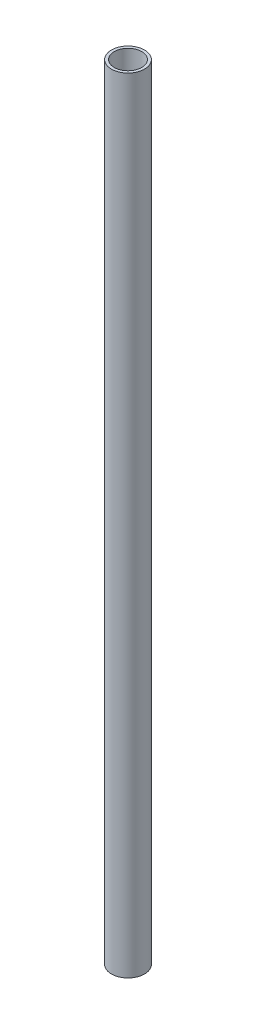
ISO-10303-21;
HEADER;
FILE_DESCRIPTION(('STEP AP214'),'2;1');
FILE_NAME('part.step','',(''),(''),'','','');
FILE_SCHEMA(('AUTOMOTIVE_DESIGN { 1 0 10303 214 1 1 1 1 }'));
ENDSEC;
DATA;
#1=APPLICATION_CONTEXT('core data for automotive mechanical design processes');
#2=APPLICATION_PROTOCOL_DEFINITION('international standard','automotive_design',2000,#1);
#3=PRODUCT_CONTEXT('',#1,'mechanical');
#4=PRODUCT('Part','Part','',(#3));
#5=PRODUCT_RELATED_PRODUCT_CATEGORY('part','',(#4));
#6=PRODUCT_DEFINITION_FORMATION('','',#4);
#7=PRODUCT_DEFINITION_CONTEXT('part definition',#1,'design');
#8=PRODUCT_DEFINITION('design','',#6,#7);
#9=PRODUCT_DEFINITION_SHAPE('','',#8);
#10=(LENGTH_UNIT() NAMED_UNIT(*) SI_UNIT(.MILLI.,.METRE.));
#11=(NAMED_UNIT(*) PLANE_ANGLE_UNIT() SI_UNIT($,.RADIAN.));
#12=(NAMED_UNIT(*) SI_UNIT($,.STERADIAN.) SOLID_ANGLE_UNIT());
#13=UNCERTAINTY_MEASURE_WITH_UNIT(LENGTH_MEASURE(1.E-05),#10,'distance_accuracy_value','');
#14=(GEOMETRIC_REPRESENTATION_CONTEXT(3) GLOBAL_UNCERTAINTY_ASSIGNED_CONTEXT((#13)) GLOBAL_UNIT_ASSIGNED_CONTEXT((#10,
#11,#12)) REPRESENTATION_CONTEXT('',''));
#15=CARTESIAN_POINT('',(0.,0.,0.));
#16=DIRECTION('',(0.,0.,1.));
#17=DIRECTION('',(1.,0.,0.));
#18=AXIS2_PLACEMENT_3D('',#15,#16,#17);
#19=CARTESIAN_POINT('',(0.,996.95,0.));
#20=DIRECTION('',(0.,1.,0.));
#21=DIRECTION('',(0.,0.,1.));
#22=AXIS2_PLACEMENT_3D('',#19,#20,#21);
#23=PLANE('',#22);
#24=CARTESIAN_POINT('',(0.,996.95,0.));
#25=DIRECTION('',(0.,1.,0.));
#26=DIRECTION('',(0.,0.,1.));
#27=AXIS2_PLACEMENT_3D('',#24,#25,#26);
#28=CIRCLE('',#27,21.082);
#29=CARTESIAN_POINT('',(0.,996.95,21.082));
#30=VERTEX_POINT('',#29);
#31=EDGE_CURVE('E12',#30,#30,#28,.T.);
#32=ORIENTED_EDGE('',*,*,#31,.T.);
#33=EDGE_LOOP('',(#32));
#34=FACE_BOUND('',#33,.T.);
#35=CARTESIAN_POINT('',(0.,996.95,0.));
#36=DIRECTION('',(0.,1.,0.));
#37=DIRECTION('',(0.,0.,1.));
#38=AXIS2_PLACEMENT_3D('',#35,#36,#37);
#39=CIRCLE('',#38,17.526);
#40=CARTESIAN_POINT('',(0.,996.95,17.526));
#41=VERTEX_POINT('',#40);
#42=EDGE_CURVE('E51',#41,#41,#39,.T.);
#43=ORIENTED_EDGE('',*,*,#42,.F.);
#44=EDGE_LOOP('',(#43));
#45=FACE_BOUND('',#44,.T.);
#46=ADVANCED_FACE('F40',(#34,#45),#23,.T.);
#47=CARTESIAN_POINT('',(0.,0.,0.));
#48=DIRECTION('',(0.,1.,0.));
#49=DIRECTION('',(0.,0.,1.));
#50=AXIS2_PLACEMENT_3D('',#47,#48,#49);
#51=PLANE('',#50);
#52=CARTESIAN_POINT('',(0.,0.,0.));
#53=DIRECTION('',(0.,1.,0.));
#54=DIRECTION('',(0.,0.,1.));
#55=AXIS2_PLACEMENT_3D('',#52,#53,#54);
#56=CIRCLE('',#55,21.082);
#57=CARTESIAN_POINT('',(0.,0.,21.082));
#58=VERTEX_POINT('',#57);
#59=EDGE_CURVE('E44',#58,#58,#56,.T.);
#60=ORIENTED_EDGE('',*,*,#59,.F.);
#61=EDGE_LOOP('',(#60));
#62=FACE_BOUND('',#61,.T.);
#63=CARTESIAN_POINT('',(0.,0.,0.));
#64=DIRECTION('',(0.,1.,0.));
#65=DIRECTION('',(0.,0.,1.));
#66=AXIS2_PLACEMENT_3D('',#63,#64,#65);
#67=CIRCLE('',#66,17.526);
#68=CARTESIAN_POINT('',(0.,0.,17.526));
#69=VERTEX_POINT('',#68);
#70=EDGE_CURVE('E53',#69,#69,#67,.T.);
#71=ORIENTED_EDGE('',*,*,#70,.T.);
#72=EDGE_LOOP('',(#71));
#73=FACE_BOUND('',#72,.T.);
#74=ADVANCED_FACE('F63',(#62,#73),#51,.F.);
#75=CARTESIAN_POINT('',(0.,996.95,0.));
#76=DIRECTION('',(0.,-1.,0.));
#77=DIRECTION('',(0.,0.,-1.));
#78=AXIS2_PLACEMENT_3D('',#75,#76,#77);
#79=CYLINDRICAL_SURFACE('',#78,21.082);
#80=ORIENTED_EDGE('',*,*,#31,.F.);
#81=EDGE_LOOP('',(#80));
#82=FACE_BOUND('',#81,.T.);
#83=ORIENTED_EDGE('',*,*,#59,.T.);
#84=EDGE_LOOP('',(#83));
#85=FACE_BOUND('',#84,.T.);
#86=ADVANCED_FACE('F42',(#82,#85),#79,.T.);
#87=CARTESIAN_POINT('',(0.,996.95,0.));
#88=DIRECTION('',(0.,-1.,0.));
#89=DIRECTION('',(0.,0.,-1.));
#90=AXIS2_PLACEMENT_3D('',#87,#88,#89);
#91=CYLINDRICAL_SURFACE('',#90,17.526);
#92=ORIENTED_EDGE('',*,*,#42,.T.);
#93=EDGE_LOOP('',(#92));
#94=FACE_BOUND('',#93,.T.);
#95=ORIENTED_EDGE('',*,*,#70,.F.);
#96=EDGE_LOOP('',(#95));
#97=FACE_BOUND('',#96,.T.);
#98=ADVANCED_FACE('F59',(#94,#97),#91,.F.);
#99=CLOSED_SHELL('',(#46,#74,#86,#98));
#100=MANIFOLD_SOLID_BREP('B2',#99);
#101=ADVANCED_BREP_SHAPE_REPRESENTATION('',(#18,#100),#14);
#102=SHAPE_DEFINITION_REPRESENTATION(#9,#101);
ENDSEC;
END-ISO-10303-21;
